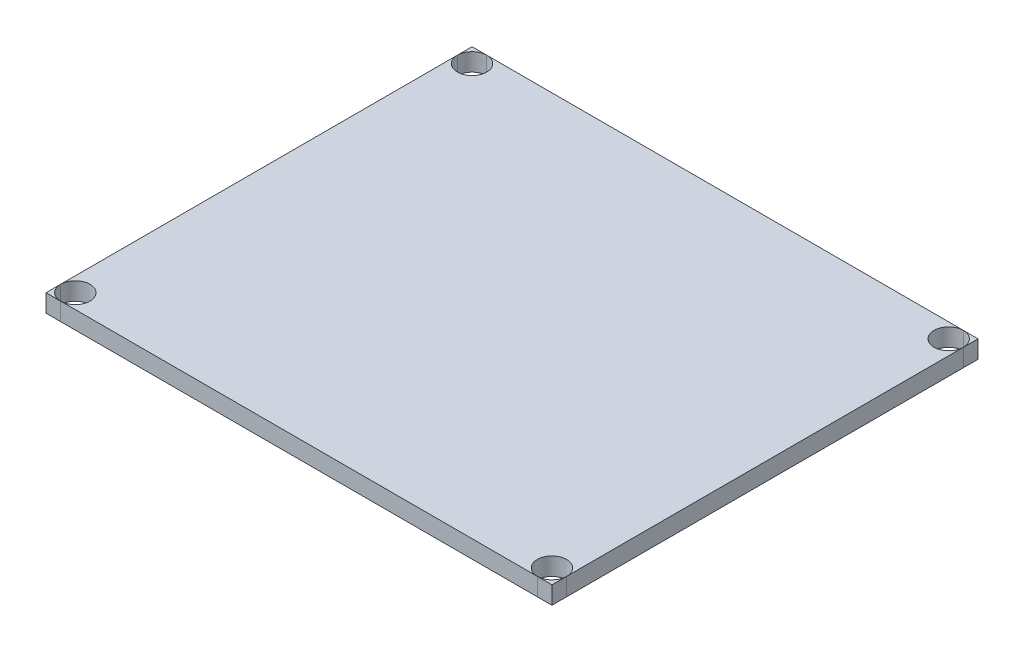
ISO-10303-21;
HEADER;
FILE_DESCRIPTION(('STEP AP214'),'2;1');
FILE_NAME('part.step','',(''),(''),'','','');
FILE_SCHEMA(('AUTOMOTIVE_DESIGN { 1 0 10303 214 1 1 1 1 }'));
ENDSEC;
DATA;
#1=APPLICATION_CONTEXT('core data for automotive mechanical design processes');
#2=APPLICATION_PROTOCOL_DEFINITION('international standard','automotive_design',2000,#1);
#3=PRODUCT_CONTEXT('',#1,'mechanical');
#4=PRODUCT('Part','Part','',(#3));
#5=PRODUCT_RELATED_PRODUCT_CATEGORY('part','',(#4));
#6=PRODUCT_DEFINITION_FORMATION('','',#4);
#7=PRODUCT_DEFINITION_CONTEXT('part definition',#1,'design');
#8=PRODUCT_DEFINITION('design','',#6,#7);
#9=PRODUCT_DEFINITION_SHAPE('','',#8);
#10=(LENGTH_UNIT() NAMED_UNIT(*) SI_UNIT(.MILLI.,.METRE.));
#11=(NAMED_UNIT(*) PLANE_ANGLE_UNIT() SI_UNIT($,.RADIAN.));
#12=(NAMED_UNIT(*) SI_UNIT($,.STERADIAN.) SOLID_ANGLE_UNIT());
#13=UNCERTAINTY_MEASURE_WITH_UNIT(LENGTH_MEASURE(1.E-05),#10,'distance_accuracy_value','');
#14=(GEOMETRIC_REPRESENTATION_CONTEXT(3) GLOBAL_UNCERTAINTY_ASSIGNED_CONTEXT((#13)) GLOBAL_UNIT_ASSIGNED_CONTEXT((#10,
#11,#12)) REPRESENTATION_CONTEXT('',''));
#15=CARTESIAN_POINT('',(0.,0.,0.));
#16=DIRECTION('',(0.,0.,1.));
#17=DIRECTION('',(1.,0.,0.));
#18=AXIS2_PLACEMENT_3D('',#15,#16,#17);
#19=CARTESIAN_POINT('',(-26.85,2.,-22.35));
#20=DIRECTION('',(0.,-1.,0.));
#21=DIRECTION('',(0.,0.,-1.));
#22=AXIS2_PLACEMENT_3D('',#19,#20,#21);
#23=CYLINDRICAL_SURFACE('',#22,1.65);
#24=CARTESIAN_POINT('',(-26.85,0.,-22.35));
#25=DIRECTION('',(0.,1.,0.));
#26=DIRECTION('',(0.,0.,1.));
#27=AXIS2_PLACEMENT_3D('',#24,#25,#26);
#28=CIRCLE('',#27,1.65);
#29=CARTESIAN_POINT('',(-26.85,0.,-24.));
#30=VERTEX_POINT('',#29);
#31=CARTESIAN_POINT('',(-28.5,0.,-22.35));
#32=VERTEX_POINT('',#31);
#33=EDGE_CURVE('E213',#30,#32,#28,.T.);
#34=ORIENTED_EDGE('',*,*,#33,.F.);
#35=DIRECTION('',(0.,-1.,0.));
#36=VECTOR('',#35,1.);
#37=CARTESIAN_POINT('',(-26.85,2.,-24.));
#38=LINE('',#37,#36);
#39=CARTESIAN_POINT('',(-26.85,2.,-24.));
#40=VERTEX_POINT('',#39);
#41=EDGE_CURVE('E13',#40,#30,#38,.T.);
#42=ORIENTED_EDGE('',*,*,#41,.F.);
#43=CARTESIAN_POINT('',(-26.85,2.,-22.35));
#44=DIRECTION('',(0.,1.,0.));
#45=DIRECTION('',(0.,0.,1.));
#46=AXIS2_PLACEMENT_3D('',#43,#44,#45);
#47=CIRCLE('',#46,1.65);
#48=CARTESIAN_POINT('',(-28.5,2.,-22.35));
#49=VERTEX_POINT('',#48);
#50=EDGE_CURVE('E211',#40,#49,#47,.T.);
#51=ORIENTED_EDGE('',*,*,#50,.T.);
#52=DIRECTION('',(0.,-1.,0.));
#53=VECTOR('',#52,1.);
#54=CARTESIAN_POINT('',(-28.5,2.,-22.35));
#55=LINE('',#54,#53);
#56=EDGE_CURVE('E209',#49,#32,#55,.T.);
#57=ORIENTED_EDGE('',*,*,#56,.T.);
#58=EDGE_LOOP('',(#34,#42,#51,#57));
#59=FACE_BOUND('',#58,.T.);
#60=ADVANCED_FACE('F176',(#59),#23,.F.);
#61=CARTESIAN_POINT('',(0.,2.,-24.));
#62=DIRECTION('',(0.,0.,-1.));
#63=DIRECTION('',(-1.,0.,0.));
#64=AXIS2_PLACEMENT_3D('',#61,#62,#63);
#65=PLANE('',#64);
#66=DIRECTION('',(1.,0.,0.));
#67=VECTOR('',#66,1.);
#68=CARTESIAN_POINT('',(0.,0.,-24.));
#69=LINE('',#68,#67);
#70=CARTESIAN_POINT('',(-28.5,0.,-24.));
#71=VERTEX_POINT('',#70);
#72=EDGE_CURVE('E227',#71,#30,#69,.T.);
#73=ORIENTED_EDGE('',*,*,#72,.F.);
#74=DIRECTION('',(0.,-1.,0.));
#75=VECTOR('',#74,1.);
#76=CARTESIAN_POINT('',(-28.5,2.,-24.));
#77=LINE('',#76,#75);
#78=CARTESIAN_POINT('',(-28.5,2.,-24.));
#79=VERTEX_POINT('',#78);
#80=EDGE_CURVE('E184',#79,#71,#77,.T.);
#81=ORIENTED_EDGE('',*,*,#80,.F.);
#82=DIRECTION('',(1.,0.,0.));
#83=VECTOR('',#82,1.);
#84=CARTESIAN_POINT('',(0.,2.,-24.));
#85=LINE('',#84,#83);
#86=EDGE_CURVE('E219',#79,#40,#85,.T.);
#87=ORIENTED_EDGE('',*,*,#86,.T.);
#88=ORIENTED_EDGE('',*,*,#41,.T.);
#89=EDGE_LOOP('',(#73,#81,#87,#88));
#90=FACE_BOUND('',#89,.T.);
#91=ADVANCED_FACE('F222',(#90),#65,.T.);
#92=CARTESIAN_POINT('',(-28.5,2.,0.));
#93=DIRECTION('',(1.,0.,0.));
#94=DIRECTION('',(0.,0.,-1.));
#95=AXIS2_PLACEMENT_3D('',#92,#93,#94);
#96=PLANE('',#95);
#97=DIRECTION('',(0.,0.,1.));
#98=VECTOR('',#97,1.);
#99=CARTESIAN_POINT('',(-28.5,0.,0.));
#100=LINE('',#99,#98);
#101=EDGE_CURVE('E220',#71,#32,#100,.T.);
#102=ORIENTED_EDGE('',*,*,#101,.T.);
#103=ORIENTED_EDGE('',*,*,#56,.F.);
#104=DIRECTION('',(0.,0.,1.));
#105=VECTOR('',#104,1.);
#106=CARTESIAN_POINT('',(-28.5,2.,0.));
#107=LINE('',#106,#105);
#108=EDGE_CURVE('E192',#79,#49,#107,.T.);
#109=ORIENTED_EDGE('',*,*,#108,.F.);
#110=ORIENTED_EDGE('',*,*,#80,.T.);
#111=EDGE_LOOP('',(#102,#103,#109,#110));
#112=FACE_BOUND('',#111,.T.);
#113=ADVANCED_FACE('F230',(#112),#96,.F.);
#114=CARTESIAN_POINT('',(0.,2.,0.));
#115=DIRECTION('',(0.,1.,0.));
#116=DIRECTION('',(0.,0.,1.));
#117=AXIS2_PLACEMENT_3D('',#114,#115,#116);
#118=PLANE('',#117);
#119=ORIENTED_EDGE('',*,*,#50,.F.);
#120=ORIENTED_EDGE('',*,*,#86,.F.);
#121=ORIENTED_EDGE('',*,*,#108,.T.);
#122=EDGE_LOOP('',(#119,#120,#121));
#123=FACE_BOUND('',#122,.T.);
#124=ADVANCED_FACE('F218',(#123),#118,.T.);
#125=CARTESIAN_POINT('',(0.,0.,0.));
#126=DIRECTION('',(0.,1.,0.));
#127=DIRECTION('',(0.,0.,1.));
#128=AXIS2_PLACEMENT_3D('',#125,#126,#127);
#129=PLANE('',#128);
#130=ORIENTED_EDGE('',*,*,#33,.T.);
#131=ORIENTED_EDGE('',*,*,#101,.F.);
#132=ORIENTED_EDGE('',*,*,#72,.T.);
#133=EDGE_LOOP('',(#130,#131,#132));
#134=FACE_BOUND('',#133,.T.);
#135=ADVANCED_FACE('F232',(#134),#129,.F.);
#136=CLOSED_SHELL('',(#60,#91,#113,#124,#135));
#137=MANIFOLD_SOLID_BREP('B2',#136);
#138=CARTESIAN_POINT('',(26.85,2.,-22.35));
#139=DIRECTION('',(0.,-1.,0.));
#140=DIRECTION('',(0.,0.,-1.));
#141=AXIS2_PLACEMENT_3D('',#138,#139,#140);
#142=CYLINDRICAL_SURFACE('',#141,1.65);
#143=CARTESIAN_POINT('',(26.85,0.,-22.35));
#144=DIRECTION('',(0.,1.,0.));
#145=DIRECTION('',(0.,0.,1.));
#146=AXIS2_PLACEMENT_3D('',#143,#144,#145);
#147=CIRCLE('',#146,1.65);
#148=CARTESIAN_POINT('',(28.5,0.,-22.35));
#149=VERTEX_POINT('',#148);
#150=CARTESIAN_POINT('',(26.85,0.,-24.));
#151=VERTEX_POINT('',#150);
#152=EDGE_CURVE('E318',#149,#151,#147,.T.);
#153=ORIENTED_EDGE('',*,*,#152,.F.);
#154=DIRECTION('',(0.,-1.,0.));
#155=VECTOR('',#154,1.);
#156=CARTESIAN_POINT('',(28.5,2.,-22.35));
#157=LINE('',#156,#155);
#158=CARTESIAN_POINT('',(28.5,2.,-22.35));
#159=VERTEX_POINT('',#158);
#160=EDGE_CURVE('E174',#159,#149,#157,.T.);
#161=ORIENTED_EDGE('',*,*,#160,.F.);
#162=CARTESIAN_POINT('',(26.85,2.,-22.35));
#163=DIRECTION('',(0.,1.,0.));
#164=DIRECTION('',(0.,0.,1.));
#165=AXIS2_PLACEMENT_3D('',#162,#163,#164);
#166=CIRCLE('',#165,1.65);
#167=CARTESIAN_POINT('',(26.85,2.,-24.));
#168=VERTEX_POINT('',#167);
#169=EDGE_CURVE('E316',#159,#168,#166,.T.);
#170=ORIENTED_EDGE('',*,*,#169,.T.);
#171=DIRECTION('',(0.,-1.,0.));
#172=VECTOR('',#171,1.);
#173=CARTESIAN_POINT('',(26.85,2.,-24.));
#174=LINE('',#173,#172);
#175=EDGE_CURVE('E300',#168,#151,#174,.T.);
#176=ORIENTED_EDGE('',*,*,#175,.T.);
#177=EDGE_LOOP('',(#153,#161,#170,#176));
#178=FACE_BOUND('',#177,.T.);
#179=ADVANCED_FACE('F284',(#178),#142,.F.);
#180=CARTESIAN_POINT('',(28.5,2.,0.));
#181=DIRECTION('',(1.,0.,0.));
#182=DIRECTION('',(0.,0.,-1.));
#183=AXIS2_PLACEMENT_3D('',#180,#181,#182);
#184=PLANE('',#183);
#185=DIRECTION('',(0.,0.,1.));
#186=VECTOR('',#185,1.);
#187=CARTESIAN_POINT('',(28.5,0.,0.));
#188=LINE('',#187,#186);
#189=CARTESIAN_POINT('',(28.5,0.,-24.));
#190=VERTEX_POINT('',#189);
#191=EDGE_CURVE('E334',#190,#149,#188,.T.);
#192=ORIENTED_EDGE('',*,*,#191,.F.);
#193=DIRECTION('',(0.,-1.,0.));
#194=VECTOR('',#193,1.);
#195=CARTESIAN_POINT('',(28.5,2.,-24.));
#196=LINE('',#195,#194);
#197=CARTESIAN_POINT('',(28.5,2.,-24.));
#198=VERTEX_POINT('',#197);
#199=EDGE_CURVE('E292',#198,#190,#196,.T.);
#200=ORIENTED_EDGE('',*,*,#199,.F.);
#201=DIRECTION('',(0.,0.,1.));
#202=VECTOR('',#201,1.);
#203=CARTESIAN_POINT('',(28.5,2.,0.));
#204=LINE('',#203,#202);
#205=EDGE_CURVE('E325',#198,#159,#204,.T.);
#206=ORIENTED_EDGE('',*,*,#205,.T.);
#207=ORIENTED_EDGE('',*,*,#160,.T.);
#208=EDGE_LOOP('',(#192,#200,#206,#207));
#209=FACE_BOUND('',#208,.T.);
#210=ADVANCED_FACE('F329',(#209),#184,.T.);
#211=CARTESIAN_POINT('',(0.,2.,-24.));
#212=DIRECTION('',(0.,0.,-1.));
#213=DIRECTION('',(-1.,0.,0.));
#214=AXIS2_PLACEMENT_3D('',#211,#212,#213);
#215=PLANE('',#214);
#216=DIRECTION('',(1.,0.,0.));
#217=VECTOR('',#216,1.);
#218=CARTESIAN_POINT('',(0.,0.,-24.));
#219=LINE('',#218,#217);
#220=EDGE_CURVE('E327',#151,#190,#219,.T.);
#221=ORIENTED_EDGE('',*,*,#220,.F.);
#222=ORIENTED_EDGE('',*,*,#175,.F.);
#223=DIRECTION('',(1.,0.,0.));
#224=VECTOR('',#223,1.);
#225=CARTESIAN_POINT('',(0.,2.,-24.));
#226=LINE('',#225,#224);
#227=EDGE_CURVE('E326',#168,#198,#226,.T.);
#228=ORIENTED_EDGE('',*,*,#227,.T.);
#229=ORIENTED_EDGE('',*,*,#199,.T.);
#230=EDGE_LOOP('',(#221,#222,#228,#229));
#231=FACE_BOUND('',#230,.T.);
#232=ADVANCED_FACE('F340',(#231),#215,.T.);
#233=CARTESIAN_POINT('',(0.,2.,0.));
#234=DIRECTION('',(0.,1.,0.));
#235=DIRECTION('',(0.,0.,1.));
#236=AXIS2_PLACEMENT_3D('',#233,#234,#235);
#237=PLANE('',#236);
#238=ORIENTED_EDGE('',*,*,#169,.F.);
#239=ORIENTED_EDGE('',*,*,#205,.F.);
#240=ORIENTED_EDGE('',*,*,#227,.F.);
#241=EDGE_LOOP('',(#238,#239,#240));
#242=FACE_BOUND('',#241,.T.);
#243=ADVANCED_FACE('F324',(#242),#237,.T.);
#244=CARTESIAN_POINT('',(0.,0.,0.));
#245=DIRECTION('',(0.,1.,0.));
#246=DIRECTION('',(0.,0.,1.));
#247=AXIS2_PLACEMENT_3D('',#244,#245,#246);
#248=PLANE('',#247);
#249=ORIENTED_EDGE('',*,*,#152,.T.);
#250=ORIENTED_EDGE('',*,*,#220,.T.);
#251=ORIENTED_EDGE('',*,*,#191,.T.);
#252=EDGE_LOOP('',(#249,#250,#251));
#253=FACE_BOUND('',#252,.T.);
#254=ADVANCED_FACE('F339',(#253),#248,.F.);
#255=CLOSED_SHELL('',(#179,#210,#232,#243,#254));
#256=MANIFOLD_SOLID_BREP('B7',#255);
#257=CARTESIAN_POINT('',(26.85,2.,22.35));
#258=DIRECTION('',(0.,-1.,0.));
#259=DIRECTION('',(0.,0.,-1.));
#260=AXIS2_PLACEMENT_3D('',#257,#258,#259);
#261=CYLINDRICAL_SURFACE('',#260,1.65);
#262=CARTESIAN_POINT('',(26.85,0.,22.35));
#263=DIRECTION('',(0.,1.,0.));
#264=DIRECTION('',(0.,0.,1.));
#265=AXIS2_PLACEMENT_3D('',#262,#263,#264);
#266=CIRCLE('',#265,1.65);
#267=CARTESIAN_POINT('',(26.85,0.,24.));
#268=VERTEX_POINT('',#267);
#269=CARTESIAN_POINT('',(28.5,0.,22.35));
#270=VERTEX_POINT('',#269);
#271=EDGE_CURVE('E428',#268,#270,#266,.T.);
#272=ORIENTED_EDGE('',*,*,#271,.F.);
#273=DIRECTION('',(0.,-1.,0.));
#274=VECTOR('',#273,1.);
#275=CARTESIAN_POINT('',(26.85,2.,24.));
#276=LINE('',#275,#274);
#277=CARTESIAN_POINT('',(26.85,2.,24.));
#278=VERTEX_POINT('',#277);
#279=EDGE_CURVE('E282',#278,#268,#276,.T.);
#280=ORIENTED_EDGE('',*,*,#279,.F.);
#281=CARTESIAN_POINT('',(26.85,2.,22.35));
#282=DIRECTION('',(0.,1.,0.));
#283=DIRECTION('',(0.,0.,1.));
#284=AXIS2_PLACEMENT_3D('',#281,#282,#283);
#285=CIRCLE('',#284,1.65);
#286=CARTESIAN_POINT('',(28.5,2.,22.35));
#287=VERTEX_POINT('',#286);
#288=EDGE_CURVE('E426',#278,#287,#285,.T.);
#289=ORIENTED_EDGE('',*,*,#288,.T.);
#290=DIRECTION('',(0.,-1.,0.));
#291=VECTOR('',#290,1.);
#292=CARTESIAN_POINT('',(28.5,2.,22.35));
#293=LINE('',#292,#291);
#294=EDGE_CURVE('E408',#287,#270,#293,.T.);
#295=ORIENTED_EDGE('',*,*,#294,.T.);
#296=EDGE_LOOP('',(#272,#280,#289,#295));
#297=FACE_BOUND('',#296,.T.);
#298=ADVANCED_FACE('F392',(#297),#261,.F.);
#299=CARTESIAN_POINT('',(0.,2.,24.));
#300=DIRECTION('',(0.,0.,-1.));
#301=DIRECTION('',(-1.,0.,0.));
#302=AXIS2_PLACEMENT_3D('',#299,#300,#301);
#303=PLANE('',#302);
#304=DIRECTION('',(1.,0.,0.));
#305=VECTOR('',#304,1.);
#306=CARTESIAN_POINT('',(0.,0.,24.));
#307=LINE('',#306,#305);
#308=CARTESIAN_POINT('',(28.5,0.,24.));
#309=VERTEX_POINT('',#308);
#310=EDGE_CURVE('E440',#268,#309,#307,.T.);
#311=ORIENTED_EDGE('',*,*,#310,.T.);
#312=DIRECTION('',(0.,-1.,0.));
#313=VECTOR('',#312,1.);
#314=CARTESIAN_POINT('',(28.5,2.,24.));
#315=LINE('',#314,#313);
#316=CARTESIAN_POINT('',(28.5,2.,24.));
#317=VERTEX_POINT('',#316);
#318=EDGE_CURVE('E400',#317,#309,#315,.T.);
#319=ORIENTED_EDGE('',*,*,#318,.F.);
#320=DIRECTION('',(1.,0.,0.));
#321=VECTOR('',#320,1.);
#322=CARTESIAN_POINT('',(0.,2.,24.));
#323=LINE('',#322,#321);
#324=EDGE_CURVE('E431',#278,#317,#323,.T.);
#325=ORIENTED_EDGE('',*,*,#324,.F.);
#326=ORIENTED_EDGE('',*,*,#279,.T.);
#327=EDGE_LOOP('',(#311,#319,#325,#326));
#328=FACE_BOUND('',#327,.T.);
#329=ADVANCED_FACE('F432',(#328),#303,.F.);
#330=CARTESIAN_POINT('',(28.5,2.,0.));
#331=DIRECTION('',(1.,0.,0.));
#332=DIRECTION('',(0.,0.,-1.));
#333=AXIS2_PLACEMENT_3D('',#330,#331,#332);
#334=PLANE('',#333);
#335=DIRECTION('',(0.,0.,1.));
#336=VECTOR('',#335,1.);
#337=CARTESIAN_POINT('',(28.5,0.,0.));
#338=LINE('',#337,#336);
#339=EDGE_CURVE('E437',#270,#309,#338,.T.);
#340=ORIENTED_EDGE('',*,*,#339,.F.);
#341=ORIENTED_EDGE('',*,*,#294,.F.);
#342=DIRECTION('',(0.,0.,1.));
#343=VECTOR('',#342,1.);
#344=CARTESIAN_POINT('',(28.5,2.,0.));
#345=LINE('',#344,#343);
#346=EDGE_CURVE('E434',#287,#317,#345,.T.);
#347=ORIENTED_EDGE('',*,*,#346,.T.);
#348=ORIENTED_EDGE('',*,*,#318,.T.);
#349=EDGE_LOOP('',(#340,#341,#347,#348));
#350=FACE_BOUND('',#349,.T.);
#351=ADVANCED_FACE('F448',(#350),#334,.T.);
#352=CARTESIAN_POINT('',(0.,2.,0.));
#353=DIRECTION('',(0.,1.,0.));
#354=DIRECTION('',(0.,0.,1.));
#355=AXIS2_PLACEMENT_3D('',#352,#353,#354);
#356=PLANE('',#355);
#357=ORIENTED_EDGE('',*,*,#288,.F.);
#358=ORIENTED_EDGE('',*,*,#324,.T.);
#359=ORIENTED_EDGE('',*,*,#346,.F.);
#360=EDGE_LOOP('',(#357,#358,#359));
#361=FACE_BOUND('',#360,.T.);
#362=ADVANCED_FACE('F436',(#361),#356,.T.);
#363=CARTESIAN_POINT('',(0.,0.,0.));
#364=DIRECTION('',(0.,1.,0.));
#365=DIRECTION('',(0.,0.,1.));
#366=AXIS2_PLACEMENT_3D('',#363,#364,#365);
#367=PLANE('',#366);
#368=ORIENTED_EDGE('',*,*,#271,.T.);
#369=ORIENTED_EDGE('',*,*,#339,.T.);
#370=ORIENTED_EDGE('',*,*,#310,.F.);
#371=EDGE_LOOP('',(#368,#369,#370));
#372=FACE_BOUND('',#371,.T.);
#373=ADVANCED_FACE('F447',(#372),#367,.F.);
#374=CLOSED_SHELL('',(#298,#329,#351,#362,#373));
#375=MANIFOLD_SOLID_BREP('B168',#374);
#376=CARTESIAN_POINT('',(-26.85,2.,22.35));
#377=DIRECTION('',(0.,-1.,0.));
#378=DIRECTION('',(0.,0.,-1.));
#379=AXIS2_PLACEMENT_3D('',#376,#377,#378);
#380=CYLINDRICAL_SURFACE('',#379,1.65);
#381=CARTESIAN_POINT('',(-26.85,0.,22.35));
#382=DIRECTION('',(0.,1.,0.));
#383=DIRECTION('',(0.,0.,1.));
#384=AXIS2_PLACEMENT_3D('',#381,#382,#383);
#385=CIRCLE('',#384,1.65);
#386=CARTESIAN_POINT('',(-28.5,0.,22.35));
#387=VERTEX_POINT('',#386);
#388=CARTESIAN_POINT('',(-26.85,0.,24.));
#389=VERTEX_POINT('',#388);
#390=EDGE_CURVE('E539',#387,#389,#385,.T.);
#391=ORIENTED_EDGE('',*,*,#390,.F.);
#392=DIRECTION('',(0.,-1.,0.));
#393=VECTOR('',#392,1.);
#394=CARTESIAN_POINT('',(-28.5,2.,22.35));
#395=LINE('',#394,#393);
#396=CARTESIAN_POINT('',(-28.5,2.,22.35));
#397=VERTEX_POINT('',#396);
#398=EDGE_CURVE('E390',#397,#387,#395,.T.);
#399=ORIENTED_EDGE('',*,*,#398,.F.);
#400=CARTESIAN_POINT('',(-26.85,2.,22.35));
#401=DIRECTION('',(0.,1.,0.));
#402=DIRECTION('',(0.,0.,1.));
#403=AXIS2_PLACEMENT_3D('',#400,#401,#402);
#404=CIRCLE('',#403,1.65);
#405=CARTESIAN_POINT('',(-26.85,2.,24.));
#406=VERTEX_POINT('',#405);
#407=EDGE_CURVE('E537',#397,#406,#404,.T.);
#408=ORIENTED_EDGE('',*,*,#407,.T.);
#409=DIRECTION('',(0.,-1.,0.));
#410=VECTOR('',#409,1.);
#411=CARTESIAN_POINT('',(-26.85,2.,24.));
#412=LINE('',#411,#410);
#413=EDGE_CURVE('E533',#406,#389,#412,.T.);
#414=ORIENTED_EDGE('',*,*,#413,.T.);
#415=EDGE_LOOP('',(#391,#399,#408,#414));
#416=FACE_BOUND('',#415,.T.);
#417=ADVANCED_FACE('F499',(#416),#380,.F.);
#418=CARTESIAN_POINT('',(-28.5,2.,0.));
#419=DIRECTION('',(1.,0.,0.));
#420=DIRECTION('',(0.,0.,-1.));
#421=AXIS2_PLACEMENT_3D('',#418,#419,#420);
#422=PLANE('',#421);
#423=DIRECTION('',(0.,0.,1.));
#424=VECTOR('',#423,1.);
#425=CARTESIAN_POINT('',(-28.5,0.,0.));
#426=LINE('',#425,#424);
#427=CARTESIAN_POINT('',(-28.5,0.,24.));
#428=VERTEX_POINT('',#427);
#429=EDGE_CURVE('E527',#387,#428,#426,.T.);
#430=ORIENTED_EDGE('',*,*,#429,.T.);
#431=DIRECTION('',(0.,-1.,0.));
#432=VECTOR('',#431,1.);
#433=CARTESIAN_POINT('',(-28.5,2.,24.));
#434=LINE('',#433,#432);
#435=CARTESIAN_POINT('',(-28.5,2.,24.));
#436=VERTEX_POINT('',#435);
#437=EDGE_CURVE('E507',#436,#428,#434,.T.);
#438=ORIENTED_EDGE('',*,*,#437,.F.);
#439=DIRECTION('',(0.,0.,1.));
#440=VECTOR('',#439,1.);
#441=CARTESIAN_POINT('',(-28.5,2.,0.));
#442=LINE('',#441,#440);
#443=EDGE_CURVE('E540',#397,#436,#442,.T.);
#444=ORIENTED_EDGE('',*,*,#443,.F.);
#445=ORIENTED_EDGE('',*,*,#398,.T.);
#446=EDGE_LOOP('',(#430,#438,#444,#445));
#447=FACE_BOUND('',#446,.T.);
#448=ADVANCED_FACE('F541',(#447),#422,.F.);
#449=CARTESIAN_POINT('',(0.,2.,24.));
#450=DIRECTION('',(0.,0.,-1.));
#451=DIRECTION('',(-1.,0.,0.));
#452=AXIS2_PLACEMENT_3D('',#449,#450,#451);
#453=PLANE('',#452);
#454=DIRECTION('',(1.,0.,0.));
#455=VECTOR('',#454,1.);
#456=CARTESIAN_POINT('',(0.,0.,24.));
#457=LINE('',#456,#455);
#458=EDGE_CURVE('E544',#428,#389,#457,.T.);
#459=ORIENTED_EDGE('',*,*,#458,.T.);
#460=ORIENTED_EDGE('',*,*,#413,.F.);
#461=DIRECTION('',(1.,0.,0.));
#462=VECTOR('',#461,1.);
#463=CARTESIAN_POINT('',(0.,2.,24.));
#464=LINE('',#463,#462);
#465=EDGE_CURVE('E515',#436,#406,#464,.T.);
#466=ORIENTED_EDGE('',*,*,#465,.F.);
#467=ORIENTED_EDGE('',*,*,#437,.T.);
#468=EDGE_LOOP('',(#459,#460,#466,#467));
#469=FACE_BOUND('',#468,.T.);
#470=ADVANCED_FACE('F553',(#469),#453,.F.);
#471=CARTESIAN_POINT('',(0.,2.,0.));
#472=DIRECTION('',(0.,1.,0.));
#473=DIRECTION('',(0.,0.,1.));
#474=AXIS2_PLACEMENT_3D('',#471,#472,#473);
#475=PLANE('',#474);
#476=ORIENTED_EDGE('',*,*,#407,.F.);
#477=ORIENTED_EDGE('',*,*,#443,.T.);
#478=ORIENTED_EDGE('',*,*,#465,.T.);
#479=EDGE_LOOP('',(#476,#477,#478));
#480=FACE_BOUND('',#479,.T.);
#481=ADVANCED_FACE('F543',(#480),#475,.T.);
#482=CARTESIAN_POINT('',(0.,0.,0.));
#483=DIRECTION('',(0.,1.,0.));
#484=DIRECTION('',(0.,0.,1.));
#485=AXIS2_PLACEMENT_3D('',#482,#483,#484);
#486=PLANE('',#485);
#487=ORIENTED_EDGE('',*,*,#390,.T.);
#488=ORIENTED_EDGE('',*,*,#458,.F.);
#489=ORIENTED_EDGE('',*,*,#429,.F.);
#490=EDGE_LOOP('',(#487,#488,#489));
#491=FACE_BOUND('',#490,.T.);
#492=ADVANCED_FACE('F555',(#491),#486,.F.);
#493=CLOSED_SHELL('',(#417,#448,#470,#481,#492));
#494=MANIFOLD_SOLID_BREP('B276',#493);
#495=CARTESIAN_POINT('',(-26.85,2.,22.35));
#496=DIRECTION('',(0.,-1.,0.));
#497=DIRECTION('',(0.,0.,-1.));
#498=AXIS2_PLACEMENT_3D('',#495,#496,#497);
#499=CYLINDRICAL_SURFACE('',#498,1.65);
#500=CARTESIAN_POINT('',(-26.85,0.,22.35));
#501=DIRECTION('',(0.,1.,0.));
#502=DIRECTION('',(0.,0.,1.));
#503=AXIS2_PLACEMENT_3D('',#500,#501,#502);
#504=CIRCLE('',#503,1.65);
#505=CARTESIAN_POINT('',(-26.85,0.,24.));
#506=VERTEX_POINT('',#505);
#507=CARTESIAN_POINT('',(-28.5,0.,22.35));
#508=VERTEX_POINT('',#507);
#509=EDGE_CURVE('E691',#506,#508,#504,.T.);
#510=ORIENTED_EDGE('',*,*,#509,.F.);
#511=DIRECTION('',(0.,-1.,0.));
#512=VECTOR('',#511,1.);
#513=CARTESIAN_POINT('',(-26.85,2.,24.));
#514=LINE('',#513,#512);
#515=CARTESIAN_POINT('',(-26.85,2.,24.));
#516=VERTEX_POINT('',#515);
#517=EDGE_CURVE('E497',#516,#506,#514,.T.);
#518=ORIENTED_EDGE('',*,*,#517,.F.);
#519=CARTESIAN_POINT('',(-26.85,2.,22.35));
#520=DIRECTION('',(0.,1.,0.));
#521=DIRECTION('',(0.,0.,1.));
#522=AXIS2_PLACEMENT_3D('',#519,#520,#521);
#523=CIRCLE('',#522,1.65);
#524=CARTESIAN_POINT('',(-28.5,2.,22.35));
#525=VERTEX_POINT('',#524);
#526=EDGE_CURVE('E711',#516,#525,#523,.T.);
#527=ORIENTED_EDGE('',*,*,#526,.T.);
#528=DIRECTION('',(0.,-1.,0.));
#529=VECTOR('',#528,1.);
#530=CARTESIAN_POINT('',(-28.5,2.,22.35));
#531=LINE('',#530,#529);
#532=EDGE_CURVE('E647',#525,#508,#531,.T.);
#533=ORIENTED_EDGE('',*,*,#532,.T.);
#534=EDGE_LOOP('',(#510,#518,#527,#533));
#535=FACE_BOUND('',#534,.T.);
#536=ADVANCED_FACE('F597',(#535),#499,.F.);
#537=CARTESIAN_POINT('',(0.,2.,24.));
#538=DIRECTION('',(0.,0.,-1.));
#539=DIRECTION('',(-1.,0.,0.));
#540=AXIS2_PLACEMENT_3D('',#537,#538,#539);
#541=PLANE('',#540);
#542=DIRECTION('',(1.,0.,0.));
#543=VECTOR('',#542,1.);
#544=CARTESIAN_POINT('',(0.,0.,24.));
#545=LINE('',#544,#543);
#546=CARTESIAN_POINT('',(26.85,0.,24.));
#547=VERTEX_POINT('',#546);
#548=EDGE_CURVE('E694',#506,#547,#545,.T.);
#549=ORIENTED_EDGE('',*,*,#548,.T.);
#550=DIRECTION('',(0.,-1.,0.));
#551=VECTOR('',#550,1.);
#552=CARTESIAN_POINT('',(26.85,2.,24.));
#553=LINE('',#552,#551);
#554=CARTESIAN_POINT('',(26.85,2.,24.));
#555=VERTEX_POINT('',#554);
#556=EDGE_CURVE('E605',#555,#547,#553,.T.);
#557=ORIENTED_EDGE('',*,*,#556,.F.);
#558=DIRECTION('',(1.,0.,0.));
#559=VECTOR('',#558,1.);
#560=CARTESIAN_POINT('',(0.,2.,24.));
#561=LINE('',#560,#559);
#562=EDGE_CURVE('E736',#516,#555,#561,.T.);
#563=ORIENTED_EDGE('',*,*,#562,.F.);
#564=ORIENTED_EDGE('',*,*,#517,.T.);
#565=EDGE_LOOP('',(#549,#557,#563,#564));
#566=FACE_BOUND('',#565,.T.);
#567=ADVANCED_FACE('F727',(#566),#541,.F.);
#568=CARTESIAN_POINT('',(26.85,2.,22.35));
#569=DIRECTION('',(0.,-1.,0.));
#570=DIRECTION('',(0.,0.,-1.));
#571=AXIS2_PLACEMENT_3D('',#568,#569,#570);
#572=CYLINDRICAL_SURFACE('',#571,1.65);
#573=CARTESIAN_POINT('',(26.85,0.,22.35));
#574=DIRECTION('',(0.,1.,0.));
#575=DIRECTION('',(0.,0.,1.));
#576=AXIS2_PLACEMENT_3D('',#573,#574,#575);
#577=CIRCLE('',#576,1.65);
#578=CARTESIAN_POINT('',(28.5,0.,22.35));
#579=VERTEX_POINT('',#578);
#580=EDGE_CURVE('E697',#579,#547,#577,.T.);
#581=ORIENTED_EDGE('',*,*,#580,.F.);
#582=DIRECTION('',(0.,-1.,0.));
#583=VECTOR('',#582,1.);
#584=CARTESIAN_POINT('',(28.5,2.,22.35));
#585=LINE('',#584,#583);
#586=CARTESIAN_POINT('',(28.5,2.,22.35));
#587=VERTEX_POINT('',#586);
#588=EDGE_CURVE('E717',#587,#579,#585,.T.);
#589=ORIENTED_EDGE('',*,*,#588,.F.);
#590=CARTESIAN_POINT('',(26.85,2.,22.35));
#591=DIRECTION('',(0.,1.,0.));
#592=DIRECTION('',(0.,0.,1.));
#593=AXIS2_PLACEMENT_3D('',#590,#591,#592);
#594=CIRCLE('',#593,1.65);
#595=EDGE_CURVE('E724',#587,#555,#594,.T.);
#596=ORIENTED_EDGE('',*,*,#595,.T.);
#597=ORIENTED_EDGE('',*,*,#556,.T.);
#598=EDGE_LOOP('',(#581,#589,#596,#597));
#599=FACE_BOUND('',#598,.T.);
#600=ADVANCED_FACE('F722',(#599),#572,.F.);
#601=CARTESIAN_POINT('',(28.5,2.,0.));
#602=DIRECTION('',(1.,0.,0.));
#603=DIRECTION('',(0.,0.,-1.));
#604=AXIS2_PLACEMENT_3D('',#601,#602,#603);
#605=PLANE('',#604);
#606=DIRECTION('',(0.,0.,1.));
#607=VECTOR('',#606,1.);
#608=CARTESIAN_POINT('',(28.5,0.,0.));
#609=LINE('',#608,#607);
#610=CARTESIAN_POINT('',(28.5,0.,-22.35));
#611=VERTEX_POINT('',#610);
#612=EDGE_CURVE('E700',#611,#579,#609,.T.);
#613=ORIENTED_EDGE('',*,*,#612,.F.);
#614=DIRECTION('',(0.,-1.,0.));
#615=VECTOR('',#614,1.);
#616=CARTESIAN_POINT('',(28.5,2.,-22.35));
#617=LINE('',#616,#615);
#618=CARTESIAN_POINT('',(28.5,2.,-22.35));
#619=VERTEX_POINT('',#618);
#620=EDGE_CURVE('E715',#619,#611,#617,.T.);
#621=ORIENTED_EDGE('',*,*,#620,.F.);
#622=DIRECTION('',(0.,0.,1.));
#623=VECTOR('',#622,1.);
#624=CARTESIAN_POINT('',(28.5,2.,0.));
#625=LINE('',#624,#623);
#626=EDGE_CURVE('E735',#619,#587,#625,.T.);
#627=ORIENTED_EDGE('',*,*,#626,.T.);
#628=ORIENTED_EDGE('',*,*,#588,.T.);
#629=EDGE_LOOP('',(#613,#621,#627,#628));
#630=FACE_BOUND('',#629,.T.);
#631=ADVANCED_FACE('F733',(#630),#605,.T.);
#632=CARTESIAN_POINT('',(26.85,2.,-22.35));
#633=DIRECTION('',(0.,-1.,0.));
#634=DIRECTION('',(0.,0.,-1.));
#635=AXIS2_PLACEMENT_3D('',#632,#633,#634);
#636=CYLINDRICAL_SURFACE('',#635,1.65);
#637=CARTESIAN_POINT('',(26.85,0.,-22.35));
#638=DIRECTION('',(0.,1.,0.));
#639=DIRECTION('',(0.,0.,1.));
#640=AXIS2_PLACEMENT_3D('',#637,#638,#639);
#641=CIRCLE('',#640,1.65);
#642=CARTESIAN_POINT('',(26.85,0.,-24.));
#643=VERTEX_POINT('',#642);
#644=EDGE_CURVE('E703',#643,#611,#641,.T.);
#645=ORIENTED_EDGE('',*,*,#644,.F.);
#646=DIRECTION('',(0.,-1.,0.));
#647=VECTOR('',#646,1.);
#648=CARTESIAN_POINT('',(26.85,2.,-24.));
#649=LINE('',#648,#647);
#650=CARTESIAN_POINT('',(26.85,2.,-24.));
#651=VERTEX_POINT('',#650);
#652=EDGE_CURVE('E677',#651,#643,#649,.T.);
#653=ORIENTED_EDGE('',*,*,#652,.F.);
#654=CARTESIAN_POINT('',(26.85,2.,-22.35));
#655=DIRECTION('',(0.,1.,0.));
#656=DIRECTION('',(0.,0.,1.));
#657=AXIS2_PLACEMENT_3D('',#654,#655,#656);
#658=CIRCLE('',#657,1.65);
#659=EDGE_CURVE('E684',#651,#619,#658,.T.);
#660=ORIENTED_EDGE('',*,*,#659,.T.);
#661=ORIENTED_EDGE('',*,*,#620,.T.);
#662=EDGE_LOOP('',(#645,#653,#660,#661));
#663=FACE_BOUND('',#662,.T.);
#664=ADVANCED_FACE('F742',(#663),#636,.F.);
#665=CARTESIAN_POINT('',(0.,2.,-24.));
#666=DIRECTION('',(0.,0.,-1.));
#667=DIRECTION('',(-1.,0.,0.));
#668=AXIS2_PLACEMENT_3D('',#665,#666,#667);
#669=PLANE('',#668);
#670=DIRECTION('',(1.,0.,0.));
#671=VECTOR('',#670,1.);
#672=CARTESIAN_POINT('',(0.,0.,-24.));
#673=LINE('',#672,#671);
#674=CARTESIAN_POINT('',(-26.85,0.,-24.));
#675=VERTEX_POINT('',#674);
#676=EDGE_CURVE('E672',#675,#643,#673,.T.);
#677=ORIENTED_EDGE('',*,*,#676,.F.);
#678=DIRECTION('',(0.,-1.,0.));
#679=VECTOR('',#678,1.);
#680=CARTESIAN_POINT('',(-26.85,2.,-24.));
#681=LINE('',#680,#679);
#682=CARTESIAN_POINT('',(-26.85,2.,-24.));
#683=VERTEX_POINT('',#682);
#684=EDGE_CURVE('E667',#683,#675,#681,.T.);
#685=ORIENTED_EDGE('',*,*,#684,.F.);
#686=DIRECTION('',(1.,0.,0.));
#687=VECTOR('',#686,1.);
#688=CARTESIAN_POINT('',(0.,2.,-24.));
#689=LINE('',#688,#687);
#690=EDGE_CURVE('E670',#683,#651,#689,.T.);
#691=ORIENTED_EDGE('',*,*,#690,.T.);
#692=ORIENTED_EDGE('',*,*,#652,.T.);
#693=EDGE_LOOP('',(#677,#685,#691,#692));
#694=FACE_BOUND('',#693,.T.);
#695=ADVANCED_FACE('F669',(#694),#669,.T.);
#696=CARTESIAN_POINT('',(-26.85,2.,-22.35));
#697=DIRECTION('',(0.,-1.,0.));
#698=DIRECTION('',(0.,0.,-1.));
#699=AXIS2_PLACEMENT_3D('',#696,#697,#698);
#700=CYLINDRICAL_SURFACE('',#699,1.65);
#701=CARTESIAN_POINT('',(-26.85,0.,-22.35));
#702=DIRECTION('',(0.,1.,0.));
#703=DIRECTION('',(0.,0.,1.));
#704=AXIS2_PLACEMENT_3D('',#701,#702,#703);
#705=CIRCLE('',#704,1.65);
#706=CARTESIAN_POINT('',(-28.5,0.,-22.35));
#707=VERTEX_POINT('',#706);
#708=EDGE_CURVE('E707',#707,#675,#705,.T.);
#709=ORIENTED_EDGE('',*,*,#708,.F.);
#710=DIRECTION('',(0.,-1.,0.));
#711=VECTOR('',#710,1.);
#712=CARTESIAN_POINT('',(-28.5,2.,-22.35));
#713=LINE('',#712,#711);
#714=CARTESIAN_POINT('',(-28.5,2.,-22.35));
#715=VERTEX_POINT('',#714);
#716=EDGE_CURVE('E640',#715,#707,#713,.T.);
#717=ORIENTED_EDGE('',*,*,#716,.F.);
#718=CARTESIAN_POINT('',(-26.85,2.,-22.35));
#719=DIRECTION('',(0.,1.,0.));
#720=DIRECTION('',(0.,0.,1.));
#721=AXIS2_PLACEMENT_3D('',#718,#719,#720);
#722=CIRCLE('',#721,1.65);
#723=EDGE_CURVE('E681',#715,#683,#722,.T.);
#724=ORIENTED_EDGE('',*,*,#723,.T.);
#725=ORIENTED_EDGE('',*,*,#684,.T.);
#726=EDGE_LOOP('',(#709,#717,#724,#725));
#727=FACE_BOUND('',#726,.T.);
#728=ADVANCED_FACE('F686',(#727),#700,.F.);
#729=CARTESIAN_POINT('',(-28.5,2.,0.));
#730=DIRECTION('',(1.,0.,0.));
#731=DIRECTION('',(0.,0.,-1.));
#732=AXIS2_PLACEMENT_3D('',#729,#730,#731);
#733=PLANE('',#732);
#734=DIRECTION('',(0.,0.,1.));
#735=VECTOR('',#734,1.);
#736=CARTESIAN_POINT('',(-28.5,0.,0.));
#737=LINE('',#736,#735);
#738=EDGE_CURVE('E709',#707,#508,#737,.T.);
#739=ORIENTED_EDGE('',*,*,#738,.T.);
#740=ORIENTED_EDGE('',*,*,#532,.F.);
#741=DIRECTION('',(0.,0.,1.));
#742=VECTOR('',#741,1.);
#743=CARTESIAN_POINT('',(-28.5,2.,0.));
#744=LINE('',#743,#742);
#745=EDGE_CURVE('E613',#715,#525,#744,.T.);
#746=ORIENTED_EDGE('',*,*,#745,.F.);
#747=ORIENTED_EDGE('',*,*,#716,.T.);
#748=EDGE_LOOP('',(#739,#740,#746,#747));
#749=FACE_BOUND('',#748,.T.);
#750=ADVANCED_FACE('F743',(#749),#733,.F.);
#751=CARTESIAN_POINT('',(0.,2.,0.));
#752=DIRECTION('',(0.,1.,0.));
#753=DIRECTION('',(0.,0.,1.));
#754=AXIS2_PLACEMENT_3D('',#751,#752,#753);
#755=PLANE('',#754);
#756=ORIENTED_EDGE('',*,*,#526,.F.);
#757=ORIENTED_EDGE('',*,*,#562,.T.);
#758=ORIENTED_EDGE('',*,*,#595,.F.);
#759=ORIENTED_EDGE('',*,*,#626,.F.);
#760=ORIENTED_EDGE('',*,*,#659,.F.);
#761=ORIENTED_EDGE('',*,*,#690,.F.);
#762=ORIENTED_EDGE('',*,*,#723,.F.);
#763=ORIENTED_EDGE('',*,*,#745,.T.);
#764=EDGE_LOOP('',(#756,#757,#758,#759,#760,#761,#762,#763));
#765=FACE_BOUND('',#764,.T.);
#766=ADVANCED_FACE('F680',(#765),#755,.T.);
#767=CARTESIAN_POINT('',(0.,0.,0.));
#768=DIRECTION('',(0.,1.,0.));
#769=DIRECTION('',(0.,0.,1.));
#770=AXIS2_PLACEMENT_3D('',#767,#768,#769);
#771=PLANE('',#770);
#772=ORIENTED_EDGE('',*,*,#509,.T.);
#773=ORIENTED_EDGE('',*,*,#738,.F.);
#774=ORIENTED_EDGE('',*,*,#708,.T.);
#775=ORIENTED_EDGE('',*,*,#676,.T.);
#776=ORIENTED_EDGE('',*,*,#644,.T.);
#777=ORIENTED_EDGE('',*,*,#612,.T.);
#778=ORIENTED_EDGE('',*,*,#580,.T.);
#779=ORIENTED_EDGE('',*,*,#548,.F.);
#780=EDGE_LOOP('',(#772,#773,#774,#775,#776,#777,#778,#779));
#781=FACE_BOUND('',#780,.T.);
#782=ADVANCED_FACE('F729',(#781),#771,.F.);
#783=CLOSED_SHELL('',(#536,#567,#600,#631,#664,#695,#728,#750,#766,#782));
#784=MANIFOLD_SOLID_BREP('B384',#783);
#785=ADVANCED_BREP_SHAPE_REPRESENTATION('',(#18,#137,#256,#375,#494,#784),#14);
#786=SHAPE_DEFINITION_REPRESENTATION(#9,#785);
ENDSEC;
END-ISO-10303-21;
